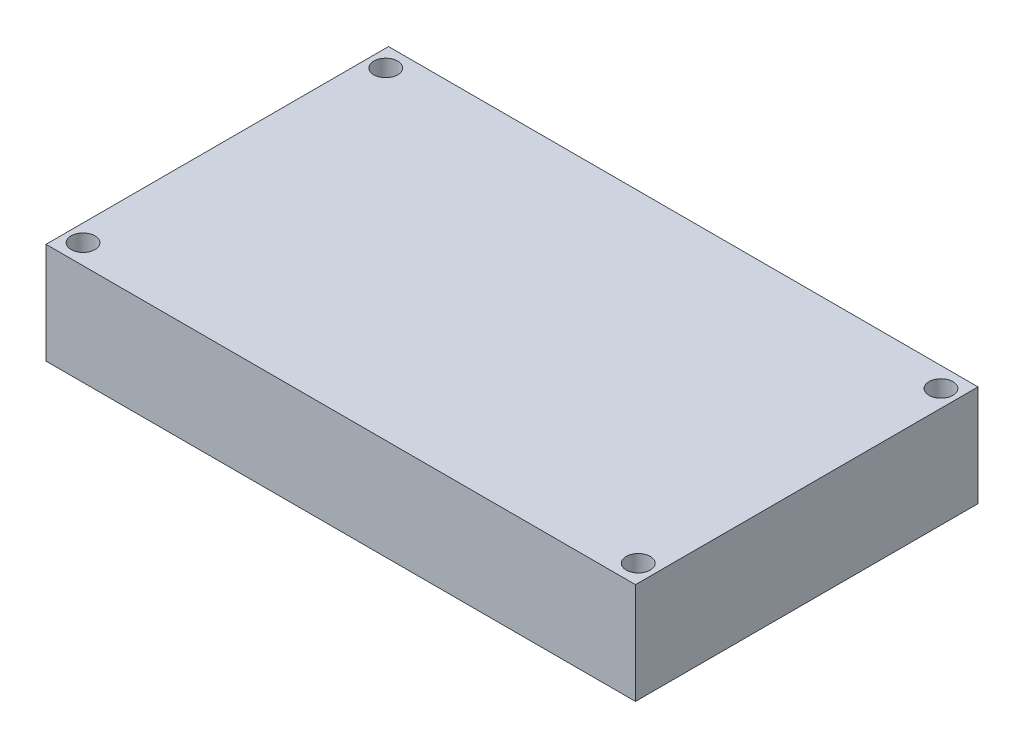
ISO-10303-21;
HEADER;
FILE_DESCRIPTION(('STEP AP214'),'2;1');
FILE_NAME('part.step','',(''),(''),'','','');
FILE_SCHEMA(('AUTOMOTIVE_DESIGN { 1 0 10303 214 1 1 1 1 }'));
ENDSEC;
DATA;
#1=APPLICATION_CONTEXT('core data for automotive mechanical design processes');
#2=APPLICATION_PROTOCOL_DEFINITION('international standard','automotive_design',2000,#1);
#3=PRODUCT_CONTEXT('',#1,'mechanical');
#4=PRODUCT('Part','Part','',(#3));
#5=PRODUCT_RELATED_PRODUCT_CATEGORY('part','',(#4));
#6=PRODUCT_DEFINITION_FORMATION('','',#4);
#7=PRODUCT_DEFINITION_CONTEXT('part definition',#1,'design');
#8=PRODUCT_DEFINITION('design','',#6,#7);
#9=PRODUCT_DEFINITION_SHAPE('','',#8);
#10=(LENGTH_UNIT() NAMED_UNIT(*) SI_UNIT(.MILLI.,.METRE.));
#11=(NAMED_UNIT(*) PLANE_ANGLE_UNIT() SI_UNIT($,.RADIAN.));
#12=(NAMED_UNIT(*) SI_UNIT($,.STERADIAN.) SOLID_ANGLE_UNIT());
#13=UNCERTAINTY_MEASURE_WITH_UNIT(LENGTH_MEASURE(1.E-05),#10,'distance_accuracy_value','');
#14=(GEOMETRIC_REPRESENTATION_CONTEXT(3) GLOBAL_UNCERTAINTY_ASSIGNED_CONTEXT((#13)) GLOBAL_UNIT_ASSIGNED_CONTEXT((#10,
#11,#12)) REPRESENTATION_CONTEXT('',''));
#15=CARTESIAN_POINT('',(0.,0.,0.));
#16=DIRECTION('',(0.,0.,1.));
#17=DIRECTION('',(1.,0.,0.));
#18=AXIS2_PLACEMENT_3D('',#15,#16,#17);
#19=CARTESIAN_POINT('',(0.,12.7,0.));
#20=DIRECTION('',(0.,-1.,0.));
#21=DIRECTION('',(0.,0.,-1.));
#22=AXIS2_PLACEMENT_3D('',#19,#20,#21);
#23=PLANE('',#22);
#24=DIRECTION('',(0.,0.,1.));
#25=VECTOR('',#24,1.);
#26=CARTESIAN_POINT('',(0.,12.7,0.));
#27=LINE('',#26,#25);
#28=CARTESIAN_POINT('',(0.,12.7,-43.));
#29=VERTEX_POINT('',#28);
#30=CARTESIAN_POINT('',(0.,12.7,0.));
#31=VERTEX_POINT('',#30);
#32=EDGE_CURVE('E85',#29,#31,#27,.T.);
#33=ORIENTED_EDGE('',*,*,#32,.T.);
#34=DIRECTION('',(1.,0.,0.));
#35=VECTOR('',#34,1.);
#36=CARTESIAN_POINT('',(0.,12.7,0.));
#37=LINE('',#36,#35);
#38=CARTESIAN_POINT('',(74.,12.7,0.));
#39=VERTEX_POINT('',#38);
#40=EDGE_CURVE('E80',#31,#39,#37,.T.);
#41=ORIENTED_EDGE('',*,*,#40,.T.);
#42=DIRECTION('',(0.,0.,-1.));
#43=VECTOR('',#42,1.);
#44=CARTESIAN_POINT('',(74.,12.7,0.));
#45=LINE('',#44,#43);
#46=CARTESIAN_POINT('',(74.,12.7,-43.));
#47=VERTEX_POINT('',#46);
#48=EDGE_CURVE('E83',#39,#47,#45,.T.);
#49=ORIENTED_EDGE('',*,*,#48,.T.);
#50=DIRECTION('',(-1.,0.,0.));
#51=VECTOR('',#50,1.);
#52=CARTESIAN_POINT('',(0.,12.7,-43.));
#53=LINE('',#52,#51);
#54=EDGE_CURVE('E50',#47,#29,#53,.T.);
#55=ORIENTED_EDGE('',*,*,#54,.T.);
#56=EDGE_LOOP('',(#33,#41,#49,#55));
#57=FACE_BOUND('',#56,.T.);
#58=CARTESIAN_POINT('',(2.15,12.7,-40.5));
#59=DIRECTION('',(0.,1.,0.));
#60=DIRECTION('',(0.,0.,1.));
#61=AXIS2_PLACEMENT_3D('',#58,#59,#60);
#62=CIRCLE('',#61,1.5);
#63=CARTESIAN_POINT('',(2.15,12.7,-39.));
#64=VERTEX_POINT('',#63);
#65=EDGE_CURVE('E100',#64,#64,#62,.T.);
#66=ORIENTED_EDGE('',*,*,#65,.F.);
#67=EDGE_LOOP('',(#66));
#68=FACE_BOUND('',#67,.T.);
#69=CARTESIAN_POINT('',(71.85,12.7,-40.5));
#70=DIRECTION('',(0.,1.,0.));
#71=DIRECTION('',(0.,0.,1.));
#72=AXIS2_PLACEMENT_3D('',#69,#70,#71);
#73=CIRCLE('',#72,1.5);
#74=CARTESIAN_POINT('',(71.85,12.7,-39.));
#75=VERTEX_POINT('',#74);
#76=EDGE_CURVE('E115',#75,#75,#73,.T.);
#77=ORIENTED_EDGE('',*,*,#76,.F.);
#78=EDGE_LOOP('',(#77));
#79=FACE_BOUND('',#78,.T.);
#80=CARTESIAN_POINT('',(71.85,12.7,-2.50000000000001));
#81=DIRECTION('',(0.,1.,0.));
#82=DIRECTION('',(0.,0.,1.));
#83=AXIS2_PLACEMENT_3D('',#80,#81,#82);
#84=CIRCLE('',#83,1.5);
#85=CARTESIAN_POINT('',(71.85,12.7,-1.00000000000001));
#86=VERTEX_POINT('',#85);
#87=EDGE_CURVE('E121',#86,#86,#84,.T.);
#88=ORIENTED_EDGE('',*,*,#87,.F.);
#89=EDGE_LOOP('',(#88));
#90=FACE_BOUND('',#89,.T.);
#91=CARTESIAN_POINT('',(2.15,12.7,-2.50000000000001));
#92=DIRECTION('',(0.,1.,0.));
#93=DIRECTION('',(0.,0.,1.));
#94=AXIS2_PLACEMENT_3D('',#91,#92,#93);
#95=CIRCLE('',#94,1.5);
#96=CARTESIAN_POINT('',(2.15,12.7,-1.00000000000001));
#97=VERTEX_POINT('',#96);
#98=EDGE_CURVE('E127',#97,#97,#95,.T.);
#99=ORIENTED_EDGE('',*,*,#98,.F.);
#100=EDGE_LOOP('',(#99));
#101=FACE_BOUND('',#100,.T.);
#102=ADVANCED_FACE('F33',(#57,#68,#79,#90,#101),#23,.F.);
#103=CARTESIAN_POINT('',(0.,0.,0.));
#104=DIRECTION('',(0.,-1.,0.));
#105=DIRECTION('',(0.,0.,-1.));
#106=AXIS2_PLACEMENT_3D('',#103,#104,#105);
#107=PLANE('',#106);
#108=CARTESIAN_POINT('',(71.85,0.,-2.50000000000001));
#109=DIRECTION('',(0.,1.,0.));
#110=DIRECTION('',(0.,0.,1.));
#111=AXIS2_PLACEMENT_3D('',#108,#109,#110);
#112=CIRCLE('',#111,1.5);
#113=CARTESIAN_POINT('',(71.85,0.,-1.00000000000001));
#114=VERTEX_POINT('',#113);
#115=EDGE_CURVE('E124',#114,#114,#112,.T.);
#116=ORIENTED_EDGE('',*,*,#115,.T.);
#117=EDGE_LOOP('',(#116));
#118=FACE_BOUND('',#117,.T.);
#119=CARTESIAN_POINT('',(2.15,0.,-40.5));
#120=DIRECTION('',(0.,1.,0.));
#121=DIRECTION('',(0.,0.,1.));
#122=AXIS2_PLACEMENT_3D('',#119,#120,#121);
#123=CIRCLE('',#122,1.5);
#124=CARTESIAN_POINT('',(2.15,0.,-39.));
#125=VERTEX_POINT('',#124);
#126=EDGE_CURVE('E112',#125,#125,#123,.T.);
#127=ORIENTED_EDGE('',*,*,#126,.T.);
#128=EDGE_LOOP('',(#127));
#129=FACE_BOUND('',#128,.T.);
#130=DIRECTION('',(0.,0.,1.));
#131=VECTOR('',#130,1.);
#132=CARTESIAN_POINT('',(0.,0.,0.));
#133=LINE('',#132,#131);
#134=CARTESIAN_POINT('',(0.,0.,-43.));
#135=VERTEX_POINT('',#134);
#136=CARTESIAN_POINT('',(0.,0.,0.));
#137=VERTEX_POINT('',#136);
#138=EDGE_CURVE('E97',#135,#137,#133,.T.);
#139=ORIENTED_EDGE('',*,*,#138,.F.);
#140=DIRECTION('',(-1.,0.,0.));
#141=VECTOR('',#140,1.);
#142=CARTESIAN_POINT('',(0.,0.,-43.));
#143=LINE('',#142,#141);
#144=CARTESIAN_POINT('',(74.,0.,-43.));
#145=VERTEX_POINT('',#144);
#146=EDGE_CURVE('E73',#145,#135,#143,.T.);
#147=ORIENTED_EDGE('',*,*,#146,.F.);
#148=DIRECTION('',(0.,0.,-1.));
#149=VECTOR('',#148,1.);
#150=CARTESIAN_POINT('',(74.,0.,0.));
#151=LINE('',#150,#149);
#152=CARTESIAN_POINT('',(74.,0.,0.));
#153=VERTEX_POINT('',#152);
#154=EDGE_CURVE('E67',#153,#145,#151,.T.);
#155=ORIENTED_EDGE('',*,*,#154,.F.);
#156=DIRECTION('',(1.,0.,0.));
#157=VECTOR('',#156,1.);
#158=CARTESIAN_POINT('',(0.,0.,0.));
#159=LINE('',#158,#157);
#160=EDGE_CURVE('E89',#137,#153,#159,.T.);
#161=ORIENTED_EDGE('',*,*,#160,.F.);
#162=EDGE_LOOP('',(#139,#147,#155,#161));
#163=FACE_BOUND('',#162,.T.);
#164=CARTESIAN_POINT('',(71.85,0.,-40.5));
#165=DIRECTION('',(0.,1.,0.));
#166=DIRECTION('',(0.,0.,1.));
#167=AXIS2_PLACEMENT_3D('',#164,#165,#166);
#168=CIRCLE('',#167,1.5);
#169=CARTESIAN_POINT('',(71.85,0.,-39.));
#170=VERTEX_POINT('',#169);
#171=EDGE_CURVE('E118',#170,#170,#168,.T.);
#172=ORIENTED_EDGE('',*,*,#171,.T.);
#173=EDGE_LOOP('',(#172));
#174=FACE_BOUND('',#173,.T.);
#175=CARTESIAN_POINT('',(2.15,0.,-2.50000000000001));
#176=DIRECTION('',(0.,1.,0.));
#177=DIRECTION('',(0.,0.,1.));
#178=AXIS2_PLACEMENT_3D('',#175,#176,#177);
#179=CIRCLE('',#178,1.5);
#180=CARTESIAN_POINT('',(2.15,0.,-1.00000000000001));
#181=VERTEX_POINT('',#180);
#182=EDGE_CURVE('E130',#181,#181,#179,.T.);
#183=ORIENTED_EDGE('',*,*,#182,.T.);
#184=EDGE_LOOP('',(#183));
#185=FACE_BOUND('',#184,.T.);
#186=ADVANCED_FACE('F108',(#118,#129,#163,#174,#185),#107,.T.);
#187=CARTESIAN_POINT('',(0.,12.7,0.));
#188=DIRECTION('',(1.,0.,0.));
#189=DIRECTION('',(0.,0.,-1.));
#190=AXIS2_PLACEMENT_3D('',#187,#188,#189);
#191=PLANE('',#190);
#192=ORIENTED_EDGE('',*,*,#138,.T.);
#193=DIRECTION('',(0.,-1.,0.));
#194=VECTOR('',#193,1.);
#195=CARTESIAN_POINT('',(0.,12.7,0.));
#196=LINE('',#195,#194);
#197=EDGE_CURVE('E11',#31,#137,#196,.T.);
#198=ORIENTED_EDGE('',*,*,#197,.F.);
#199=ORIENTED_EDGE('',*,*,#32,.F.);
#200=DIRECTION('',(0.,-1.,0.));
#201=VECTOR('',#200,1.);
#202=CARTESIAN_POINT('',(0.,12.7,-43.));
#203=LINE('',#202,#201);
#204=EDGE_CURVE('E93',#29,#135,#203,.T.);
#205=ORIENTED_EDGE('',*,*,#204,.T.);
#206=EDGE_LOOP('',(#192,#198,#199,#205));
#207=FACE_BOUND('',#206,.T.);
#208=ADVANCED_FACE('F35',(#207),#191,.F.);
#209=CARTESIAN_POINT('',(0.,12.7,0.));
#210=DIRECTION('',(0.,0.,-1.));
#211=DIRECTION('',(-1.,0.,0.));
#212=AXIS2_PLACEMENT_3D('',#209,#210,#211);
#213=PLANE('',#212);
#214=ORIENTED_EDGE('',*,*,#160,.T.);
#215=DIRECTION('',(0.,-1.,0.));
#216=VECTOR('',#215,1.);
#217=CARTESIAN_POINT('',(74.,12.7,0.));
#218=LINE('',#217,#216);
#219=EDGE_CURVE('E42',#39,#153,#218,.T.);
#220=ORIENTED_EDGE('',*,*,#219,.F.);
#221=ORIENTED_EDGE('',*,*,#40,.F.);
#222=ORIENTED_EDGE('',*,*,#197,.T.);
#223=EDGE_LOOP('',(#214,#220,#221,#222));
#224=FACE_BOUND('',#223,.T.);
#225=ADVANCED_FACE('F88',(#224),#213,.F.);
#226=CARTESIAN_POINT('',(74.,12.7,0.));
#227=DIRECTION('',(-1.,0.,0.));
#228=DIRECTION('',(0.,0.,1.));
#229=AXIS2_PLACEMENT_3D('',#226,#227,#228);
#230=PLANE('',#229);
#231=ORIENTED_EDGE('',*,*,#154,.T.);
#232=DIRECTION('',(0.,-1.,0.));
#233=VECTOR('',#232,1.);
#234=CARTESIAN_POINT('',(74.,12.7,-43.));
#235=LINE('',#234,#233);
#236=EDGE_CURVE('E90',#47,#145,#235,.T.);
#237=ORIENTED_EDGE('',*,*,#236,.F.);
#238=ORIENTED_EDGE('',*,*,#48,.F.);
#239=ORIENTED_EDGE('',*,*,#219,.T.);
#240=EDGE_LOOP('',(#231,#237,#238,#239));
#241=FACE_BOUND('',#240,.T.);
#242=ADVANCED_FACE('F91',(#241),#230,.F.);
#243=CARTESIAN_POINT('',(0.,12.7,-43.));
#244=DIRECTION('',(0.,0.,1.));
#245=DIRECTION('',(1.,0.,0.));
#246=AXIS2_PLACEMENT_3D('',#243,#244,#245);
#247=PLANE('',#246);
#248=ORIENTED_EDGE('',*,*,#146,.T.);
#249=ORIENTED_EDGE('',*,*,#204,.F.);
#250=ORIENTED_EDGE('',*,*,#54,.F.);
#251=ORIENTED_EDGE('',*,*,#236,.T.);
#252=EDGE_LOOP('',(#248,#249,#250,#251));
#253=FACE_BOUND('',#252,.T.);
#254=ADVANCED_FACE('F105',(#253),#247,.F.);
#255=CARTESIAN_POINT('',(2.15,12.7,-40.5));
#256=DIRECTION('',(0.,-1.,0.));
#257=DIRECTION('',(0.,0.,-1.));
#258=AXIS2_PLACEMENT_3D('',#255,#256,#257);
#259=CYLINDRICAL_SURFACE('',#258,1.5);
#260=ORIENTED_EDGE('',*,*,#65,.T.);
#261=EDGE_LOOP('',(#260));
#262=FACE_BOUND('',#261,.T.);
#263=ORIENTED_EDGE('',*,*,#126,.F.);
#264=EDGE_LOOP('',(#263));
#265=FACE_BOUND('',#264,.T.);
#266=ADVANCED_FACE('F147',(#262,#265),#259,.F.);
#267=CARTESIAN_POINT('',(71.85,12.7,-40.5));
#268=DIRECTION('',(0.,-1.,0.));
#269=DIRECTION('',(0.,0.,-1.));
#270=AXIS2_PLACEMENT_3D('',#267,#268,#269);
#271=CYLINDRICAL_SURFACE('',#270,1.5);
#272=ORIENTED_EDGE('',*,*,#76,.T.);
#273=EDGE_LOOP('',(#272));
#274=FACE_BOUND('',#273,.T.);
#275=ORIENTED_EDGE('',*,*,#171,.F.);
#276=EDGE_LOOP('',(#275));
#277=FACE_BOUND('',#276,.T.);
#278=ADVANCED_FACE('F193',(#274,#277),#271,.F.);
#279=CARTESIAN_POINT('',(71.85,12.7,-2.50000000000001));
#280=DIRECTION('',(0.,-1.,0.));
#281=DIRECTION('',(0.,0.,-1.));
#282=AXIS2_PLACEMENT_3D('',#279,#280,#281);
#283=CYLINDRICAL_SURFACE('',#282,1.5);
#284=ORIENTED_EDGE('',*,*,#87,.T.);
#285=EDGE_LOOP('',(#284));
#286=FACE_BOUND('',#285,.T.);
#287=ORIENTED_EDGE('',*,*,#115,.F.);
#288=EDGE_LOOP('',(#287));
#289=FACE_BOUND('',#288,.T.);
#290=ADVANCED_FACE('F201',(#286,#289),#283,.F.);
#291=CARTESIAN_POINT('',(2.15,12.7,-2.50000000000001));
#292=DIRECTION('',(0.,-1.,0.));
#293=DIRECTION('',(0.,0.,-1.));
#294=AXIS2_PLACEMENT_3D('',#291,#292,#293);
#295=CYLINDRICAL_SURFACE('',#294,1.5);
#296=ORIENTED_EDGE('',*,*,#98,.T.);
#297=EDGE_LOOP('',(#296));
#298=FACE_BOUND('',#297,.T.);
#299=ORIENTED_EDGE('',*,*,#182,.F.);
#300=EDGE_LOOP('',(#299));
#301=FACE_BOUND('',#300,.T.);
#302=ADVANCED_FACE('F136',(#298,#301),#295,.F.);
#303=CLOSED_SHELL('',(#102,#186,#208,#225,#242,#254,#266,#278,#290,#302));
#304=MANIFOLD_SOLID_BREP('B2',#303);
#305=ADVANCED_BREP_SHAPE_REPRESENTATION('',(#18,#304),#14);
#306=SHAPE_DEFINITION_REPRESENTATION(#9,#305);
ENDSEC;
END-ISO-10303-21;
